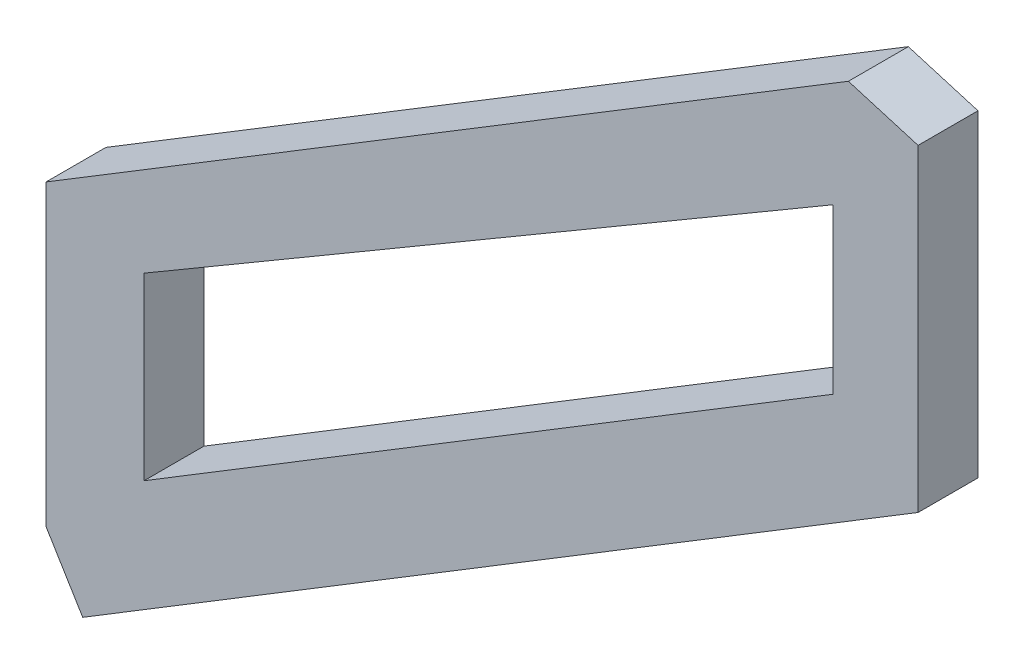
ISO-10303-21;
HEADER;
FILE_DESCRIPTION(('STEP AP214'),'2;1');
FILE_NAME('part.step','',(''),(''),'','','');
FILE_SCHEMA(('AUTOMOTIVE_DESIGN { 1 0 10303 214 1 1 1 1 }'));
ENDSEC;
DATA;
#1=APPLICATION_CONTEXT('core data for automotive mechanical design processes');
#2=APPLICATION_PROTOCOL_DEFINITION('international standard','automotive_design',2000,#1);
#3=PRODUCT_CONTEXT('',#1,'mechanical');
#4=PRODUCT('Part','Part','',(#3));
#5=PRODUCT_RELATED_PRODUCT_CATEGORY('part','',(#4));
#6=PRODUCT_DEFINITION_FORMATION('','',#4);
#7=PRODUCT_DEFINITION_CONTEXT('part definition',#1,'design');
#8=PRODUCT_DEFINITION('design','',#6,#7);
#9=PRODUCT_DEFINITION_SHAPE('','',#8);
#10=(LENGTH_UNIT() NAMED_UNIT(*) SI_UNIT(.MILLI.,.METRE.));
#11=(NAMED_UNIT(*) PLANE_ANGLE_UNIT() SI_UNIT($,.RADIAN.));
#12=(NAMED_UNIT(*) SI_UNIT($,.STERADIAN.) SOLID_ANGLE_UNIT());
#13=UNCERTAINTY_MEASURE_WITH_UNIT(LENGTH_MEASURE(1.E-05),#10,'distance_accuracy_value','');
#14=(GEOMETRIC_REPRESENTATION_CONTEXT(3) GLOBAL_UNCERTAINTY_ASSIGNED_CONTEXT((#13)) GLOBAL_UNIT_ASSIGNED_CONTEXT((#10,
#11,#12)) REPRESENTATION_CONTEXT('',''));
#15=CARTESIAN_POINT('',(0.,0.,0.));
#16=DIRECTION('',(0.,0.,1.));
#17=DIRECTION('',(1.,0.,0.));
#18=AXIS2_PLACEMENT_3D('',#15,#16,#17);
#19=CARTESIAN_POINT('',(0.115853437567894,14.2876628235082,0.));
#20=DIRECTION('',(0.,0.,-1.));
#21=DIRECTION('',(0.,-1.,0.));
#22=AXIS2_PLACEMENT_3D('',#19,#20,#21);
#23=PLANE('',#22);
#24=DIRECTION('',(0.854198477293924,0.519947075565141,0.));
#25=VECTOR('',#24,1.);
#26=CARTESIAN_POINT('',(0.701751053774181,14.5294103909423,0.));
#27=LINE('',#26,#25);
#28=CARTESIAN_POINT('',(-0.44824888714962,13.829410189493,0.));
#29=VERTEX_POINT('',#28);
#30=CARTESIAN_POINT('',(0.701751053774181,14.5294103909423,0.));
#31=VERTEX_POINT('',#30);
#32=EDGE_CURVE('E180',#29,#31,#27,.T.);
#33=ORIENTED_EDGE('',*,*,#32,.F.);
#34=DIRECTION('',(1.79754532891811E-07,-0.999999999999984,0.));
#35=VECTOR('',#34,1.);
#36=CARTESIAN_POINT('',(-0.44824888714962,13.829410189493,0.));
#37=LINE('',#36,#35);
#38=CARTESIAN_POINT('',(-0.448248941076026,14.1294104483369,0.));
#39=VERTEX_POINT('',#38);
#40=EDGE_CURVE('E194',#39,#29,#37,.T.);
#41=ORIENTED_EDGE('',*,*,#40,.F.);
#42=DIRECTION('',(-0.862791858811575,-0.505559302523914,0.));
#43=VECTOR('',#42,1.);
#44=CARTESIAN_POINT('',(-0.448248941076026,14.1294104483369,0.));
#45=LINE('',#44,#43);
#46=CARTESIAN_POINT('',(0.701751004548209,14.8032614640536,0.));
#47=VERTEX_POINT('',#46);
#48=EDGE_CURVE('E134',#47,#39,#45,.T.);
#49=ORIENTED_EDGE('',*,*,#48,.F.);
#50=DIRECTION('',(-1.79754534775004E-07,0.999999999999984,0.));
#51=VECTOR('',#50,1.);
#52=CARTESIAN_POINT('',(0.701751004548209,14.8032614640536,0.));
#53=LINE('',#52,#51);
#54=EDGE_CURVE('E120',#31,#47,#53,.T.);
#55=ORIENTED_EDGE('',*,*,#54,.F.);
#56=EDGE_LOOP('',(#33,#41,#49,#55));
#57=FACE_BOUND('',#56,.T.);
#58=DIRECTION('',(-0.854198477293923,-0.519947075565142,0.));
#59=VECTOR('',#58,1.);
#60=CARTESIAN_POINT('',(0.843550663553703,14.4294104352127,0.));
#61=LINE('',#60,#59);
#62=CARTESIAN_POINT('',(0.843550663553703,14.4294104352127,0.));
#63=VERTEX_POINT('',#62);
#64=CARTESIAN_POINT('',(-0.550574290724498,13.5808123491499,0.));
#65=VERTEX_POINT('',#64);
#66=EDGE_CURVE('E28',#63,#65,#61,.T.);
#67=ORIENTED_EDGE('',*,*,#66,.F.);
#68=DIRECTION('',(1.79754534730112E-07,-0.999999999999984,0.));
#69=VECTOR('',#68,1.);
#70=CARTESIAN_POINT('',(0.843550568174031,14.9600210977707,0.));
#71=LINE('',#70,#69);
#72=CARTESIAN_POINT('',(0.843550568174031,14.9600210977707,0.));
#73=VERTEX_POINT('',#72);
#74=EDGE_CURVE('E21',#73,#63,#71,.T.);
#75=ORIENTED_EDGE('',*,*,#74,.F.);
#76=DIRECTION('',(0.958722035180855,-0.284344965242362,0.));
#77=VECTOR('',#76,1.);
#78=CARTESIAN_POINT('',(0.727253688271433,14.9945132978665,0.));
#79=LINE('',#78,#77);
#80=CARTESIAN_POINT('',(0.727253688271433,14.9945132978665,0.));
#81=VERTEX_POINT('',#80);
#82=EDGE_CURVE('E147',#81,#73,#79,.T.);
#83=ORIENTED_EDGE('',*,*,#82,.F.);
#84=DIRECTION('',(0.854198477293924,0.51994707556514,0.));
#85=VECTOR('',#84,1.);
#86=CARTESIAN_POINT('',(-0.611843788417915,14.1794102095222,0.));
#87=LINE('',#86,#85);
#88=CARTESIAN_POINT('',(-0.611843788417915,14.1794102095222,0.));
#89=VERTEX_POINT('',#88);
#90=EDGE_CURVE('E209',#89,#81,#87,.T.);
#91=ORIENTED_EDGE('',*,*,#90,.F.);
#92=DIRECTION('',(-1.79754534642425E-07,0.999999999999984,0.));
#93=VECTOR('',#92,1.);
#94=CARTESIAN_POINT('',(-0.611843698910761,13.681469199889,0.));
#95=LINE('',#94,#93);
#96=CARTESIAN_POINT('',(-0.611843698910761,13.681469199889,0.));
#97=VERTEX_POINT('',#96);
#98=EDGE_CURVE('E167',#97,#89,#95,.T.);
#99=ORIENTED_EDGE('',*,*,#98,.F.);
#100=DIRECTION('',(-0.519947075565137,0.854198477293926,0.));
#101=VECTOR('',#100,1.);
#102=CARTESIAN_POINT('',(-0.550574290724498,13.5808123491499,0.));
#103=LINE('',#102,#101);
#104=EDGE_CURVE('E155',#65,#97,#103,.T.);
#105=ORIENTED_EDGE('',*,*,#104,.F.);
#106=EDGE_LOOP('',(#67,#75,#83,#91,#99,#105));
#107=FACE_BOUND('',#106,.T.);
#108=ADVANCED_FACE('F17',(#57,#107),#23,.F.);
#109=CARTESIAN_POINT('',(0.115853437567894,14.2876628235082,-0.1));
#110=DIRECTION('',(0.,0.,-1.));
#111=DIRECTION('',(0.,-1.,0.));
#112=AXIS2_PLACEMENT_3D('',#109,#110,#111);
#113=PLANE('',#112);
#114=DIRECTION('',(0.854198477293924,0.519947075565141,0.));
#115=VECTOR('',#114,1.);
#116=CARTESIAN_POINT('',(0.701751053774181,14.5294103909423,-0.1));
#117=LINE('',#116,#115);
#118=CARTESIAN_POINT('',(-0.44824888714962,13.829410189493,-0.1));
#119=VERTEX_POINT('',#118);
#120=CARTESIAN_POINT('',(0.701751053774181,14.5294103909423,-0.1));
#121=VERTEX_POINT('',#120);
#122=EDGE_CURVE('E114',#119,#121,#117,.T.);
#123=ORIENTED_EDGE('',*,*,#122,.T.);
#124=DIRECTION('',(-1.79754534775004E-07,0.999999999999984,0.));
#125=VECTOR('',#124,1.);
#126=CARTESIAN_POINT('',(0.701751004548209,14.8032614640536,-0.1));
#127=LINE('',#126,#125);
#128=CARTESIAN_POINT('',(0.701751004548209,14.8032614640536,-0.1));
#129=VERTEX_POINT('',#128);
#130=EDGE_CURVE('E107',#121,#129,#127,.T.);
#131=ORIENTED_EDGE('',*,*,#130,.T.);
#132=DIRECTION('',(-0.862791858811575,-0.505559302523914,0.));
#133=VECTOR('',#132,1.);
#134=CARTESIAN_POINT('',(-0.448248941076026,14.1294104483369,-0.1));
#135=LINE('',#134,#133);
#136=CARTESIAN_POINT('',(-0.448248941076026,14.1294104483369,-0.1));
#137=VERTEX_POINT('',#136);
#138=EDGE_CURVE('E112',#129,#137,#135,.T.);
#139=ORIENTED_EDGE('',*,*,#138,.T.);
#140=DIRECTION('',(1.79754532891811E-07,-0.999999999999984,0.));
#141=VECTOR('',#140,1.);
#142=CARTESIAN_POINT('',(-0.44824888714962,13.829410189493,-0.1));
#143=LINE('',#142,#141);
#144=EDGE_CURVE('E204',#137,#119,#143,.T.);
#145=ORIENTED_EDGE('',*,*,#144,.T.);
#146=EDGE_LOOP('',(#123,#131,#139,#145));
#147=FACE_BOUND('',#146,.T.);
#148=DIRECTION('',(-0.854198477293923,-0.519947075565142,0.));
#149=VECTOR('',#148,1.);
#150=CARTESIAN_POINT('',(0.843550663553703,14.4294104352127,-0.1));
#151=LINE('',#150,#149);
#152=CARTESIAN_POINT('',(0.843550663553704,14.4294104352127,-0.1));
#153=VERTEX_POINT('',#152);
#154=CARTESIAN_POINT('',(-0.550574290724498,13.5808123491499,-0.1));
#155=VERTEX_POINT('',#154);
#156=EDGE_CURVE('E11',#153,#155,#151,.T.);
#157=ORIENTED_EDGE('',*,*,#156,.T.);
#158=DIRECTION('',(-0.519947075565137,0.854198477293926,0.));
#159=VECTOR('',#158,1.);
#160=CARTESIAN_POINT('',(-0.550574290724498,13.5808123491499,-0.1));
#161=LINE('',#160,#159);
#162=CARTESIAN_POINT('',(-0.611843698910761,13.681469199889,-0.1));
#163=VERTEX_POINT('',#162);
#164=EDGE_CURVE('E165',#155,#163,#161,.T.);
#165=ORIENTED_EDGE('',*,*,#164,.T.);
#166=DIRECTION('',(-1.79754534642425E-07,0.999999999999984,0.));
#167=VECTOR('',#166,1.);
#168=CARTESIAN_POINT('',(-0.611843698910761,13.681469199889,-0.1));
#169=LINE('',#168,#167);
#170=CARTESIAN_POINT('',(-0.611843788417915,14.1794102095222,-0.1));
#171=VERTEX_POINT('',#170);
#172=EDGE_CURVE('E156',#163,#171,#169,.T.);
#173=ORIENTED_EDGE('',*,*,#172,.T.);
#174=DIRECTION('',(0.854198477293924,0.51994707556514,0.));
#175=VECTOR('',#174,1.);
#176=CARTESIAN_POINT('',(-0.611843788417915,14.1794102095222,-0.1));
#177=LINE('',#176,#175);
#178=CARTESIAN_POINT('',(0.727253688271433,14.9945132978665,-0.1));
#179=VERTEX_POINT('',#178);
#180=EDGE_CURVE('E193',#171,#179,#177,.T.);
#181=ORIENTED_EDGE('',*,*,#180,.T.);
#182=DIRECTION('',(0.958722035180855,-0.284344965242362,0.));
#183=VECTOR('',#182,1.);
#184=CARTESIAN_POINT('',(0.727253688271433,14.9945132978665,-0.1));
#185=LINE('',#184,#183);
#186=CARTESIAN_POINT('',(0.843550568174031,14.9600210977707,-0.1));
#187=VERTEX_POINT('',#186);
#188=EDGE_CURVE('E177',#179,#187,#185,.T.);
#189=ORIENTED_EDGE('',*,*,#188,.T.);
#190=DIRECTION('',(1.79754534730112E-07,-0.999999999999984,0.));
#191=VECTOR('',#190,1.);
#192=CARTESIAN_POINT('',(0.843550568174031,14.9600210977707,-0.1));
#193=LINE('',#192,#191);
#194=EDGE_CURVE('E148',#187,#153,#193,.T.);
#195=ORIENTED_EDGE('',*,*,#194,.T.);
#196=EDGE_LOOP('',(#157,#165,#173,#181,#189,#195));
#197=FACE_BOUND('',#196,.T.);
#198=ADVANCED_FACE('F109',(#147,#197),#113,.T.);
#199=CARTESIAN_POINT('',(0.843550663553703,14.4294104352127,0.));
#200=DIRECTION('',(0.519947075565142,-0.854198477293923,0.));
#201=DIRECTION('',(0.,0.,-1.));
#202=AXIS2_PLACEMENT_3D('',#199,#200,#201);
#203=PLANE('',#202);
#204=ORIENTED_EDGE('',*,*,#66,.T.);
#205=DIRECTION('',(0.,0.,-1.));
#206=VECTOR('',#205,1.);
#207=CARTESIAN_POINT('',(-0.550574290724498,13.5808123491499,0.));
#208=LINE('',#207,#206);
#209=EDGE_CURVE('E206',#65,#155,#208,.T.);
#210=ORIENTED_EDGE('',*,*,#209,.T.);
#211=ORIENTED_EDGE('',*,*,#156,.F.);
#212=DIRECTION('',(0.,0.,-1.));
#213=VECTOR('',#212,1.);
#214=CARTESIAN_POINT('',(0.843550663553703,14.4294104352127,0.));
#215=LINE('',#214,#213);
#216=EDGE_CURVE('E149',#63,#153,#215,.T.);
#217=ORIENTED_EDGE('',*,*,#216,.F.);
#218=EDGE_LOOP('',(#204,#210,#211,#217));
#219=FACE_BOUND('',#218,.T.);
#220=ADVANCED_FACE('F334',(#219),#203,.T.);
#221=CARTESIAN_POINT('',(-0.550574290724498,13.5808123491499,0.));
#222=DIRECTION('',(-0.854198477293926,-0.519947075565137,0.));
#223=DIRECTION('',(-0.519947075565137,0.854198477293926,0.));
#224=AXIS2_PLACEMENT_3D('',#221,#222,#223);
#225=PLANE('',#224);
#226=ORIENTED_EDGE('',*,*,#104,.T.);
#227=DIRECTION('',(0.,0.,-1.));
#228=VECTOR('',#227,1.);
#229=CARTESIAN_POINT('',(-0.611843698910761,13.681469199889,0.));
#230=LINE('',#229,#228);
#231=EDGE_CURVE('E152',#97,#163,#230,.T.);
#232=ORIENTED_EDGE('',*,*,#231,.T.);
#233=ORIENTED_EDGE('',*,*,#164,.F.);
#234=ORIENTED_EDGE('',*,*,#209,.F.);
#235=EDGE_LOOP('',(#226,#232,#233,#234));
#236=FACE_BOUND('',#235,.T.);
#237=ADVANCED_FACE('F337',(#236),#225,.T.);
#238=CARTESIAN_POINT('',(-0.611843698910761,13.681469199889,0.));
#239=DIRECTION('',(-0.999999999999984,-1.79754534642425E-07,0.));
#240=DIRECTION('',(-1.79754534642425E-07,0.999999999999984,0.));
#241=AXIS2_PLACEMENT_3D('',#238,#239,#240);
#242=PLANE('',#241);
#243=ORIENTED_EDGE('',*,*,#98,.T.);
#244=DIRECTION('',(0.,0.,-1.));
#245=VECTOR('',#244,1.);
#246=CARTESIAN_POINT('',(-0.611843788417915,14.1794102095222,0.));
#247=LINE('',#246,#245);
#248=EDGE_CURVE('E174',#89,#171,#247,.T.);
#249=ORIENTED_EDGE('',*,*,#248,.T.);
#250=ORIENTED_EDGE('',*,*,#172,.F.);
#251=ORIENTED_EDGE('',*,*,#231,.F.);
#252=EDGE_LOOP('',(#243,#249,#250,#251));
#253=FACE_BOUND('',#252,.T.);
#254=ADVANCED_FACE('F380',(#253),#242,.T.);
#255=CARTESIAN_POINT('',(-0.611843788417915,14.1794102095222,0.));
#256=DIRECTION('',(-0.51994707556514,0.854198477293924,0.));
#257=DIRECTION('',(0.,0.,1.));
#258=AXIS2_PLACEMENT_3D('',#255,#256,#257);
#259=PLANE('',#258);
#260=ORIENTED_EDGE('',*,*,#90,.T.);
#261=DIRECTION('',(0.,0.,-1.));
#262=VECTOR('',#261,1.);
#263=CARTESIAN_POINT('',(0.727253688271433,14.9945132978665,0.));
#264=LINE('',#263,#262);
#265=EDGE_CURVE('E212',#81,#179,#264,.T.);
#266=ORIENTED_EDGE('',*,*,#265,.T.);
#267=ORIENTED_EDGE('',*,*,#180,.F.);
#268=ORIENTED_EDGE('',*,*,#248,.F.);
#269=EDGE_LOOP('',(#260,#266,#267,#268));
#270=FACE_BOUND('',#269,.T.);
#271=ADVANCED_FACE('F322',(#270),#259,.T.);
#272=CARTESIAN_POINT('',(0.727253688271433,14.9945132978665,0.));
#273=DIRECTION('',(0.284344965242362,0.958722035180855,0.));
#274=DIRECTION('',(0.,0.,-1.));
#275=AXIS2_PLACEMENT_3D('',#272,#273,#274);
#276=PLANE('',#275);
#277=ORIENTED_EDGE('',*,*,#82,.T.);
#278=DIRECTION('',(0.,0.,-1.));
#279=VECTOR('',#278,1.);
#280=CARTESIAN_POINT('',(0.843550568174031,14.9600210977707,0.));
#281=LINE('',#280,#279);
#282=EDGE_CURVE('E143',#73,#187,#281,.T.);
#283=ORIENTED_EDGE('',*,*,#282,.T.);
#284=ORIENTED_EDGE('',*,*,#188,.F.);
#285=ORIENTED_EDGE('',*,*,#265,.F.);
#286=EDGE_LOOP('',(#277,#283,#284,#285));
#287=FACE_BOUND('',#286,.T.);
#288=ADVANCED_FACE('F326',(#287),#276,.T.);
#289=CARTESIAN_POINT('',(0.843550568174031,14.9600210977707,0.));
#290=DIRECTION('',(0.999999999999984,1.79754534730112E-07,0.));
#291=DIRECTION('',(0.,0.,-1.));
#292=AXIS2_PLACEMENT_3D('',#289,#290,#291);
#293=PLANE('',#292);
#294=ORIENTED_EDGE('',*,*,#74,.T.);
#295=ORIENTED_EDGE('',*,*,#216,.T.);
#296=ORIENTED_EDGE('',*,*,#194,.F.);
#297=ORIENTED_EDGE('',*,*,#282,.F.);
#298=EDGE_LOOP('',(#294,#295,#296,#297));
#299=FACE_BOUND('',#298,.T.);
#300=ADVANCED_FACE('F331',(#299),#293,.T.);
#301=CARTESIAN_POINT('',(-0.448248887149619,13.829410189493,0.));
#302=DIRECTION('',(-0.519947075565141,0.854198477293924,0.));
#303=DIRECTION('',(0.,0.,1.));
#304=AXIS2_PLACEMENT_3D('',#301,#302,#303);
#305=PLANE('',#304);
#306=ORIENTED_EDGE('',*,*,#32,.T.);
#307=DIRECTION('',(0.,0.,-1.));
#308=VECTOR('',#307,1.);
#309=CARTESIAN_POINT('',(0.701751053774181,14.5294103909423,0.));
#310=LINE('',#309,#308);
#311=EDGE_CURVE('E119',#31,#121,#310,.T.);
#312=ORIENTED_EDGE('',*,*,#311,.T.);
#313=ORIENTED_EDGE('',*,*,#122,.F.);
#314=DIRECTION('',(0.,0.,-1.));
#315=VECTOR('',#314,1.);
#316=CARTESIAN_POINT('',(-0.44824888714962,13.829410189493,0.));
#317=LINE('',#316,#315);
#318=EDGE_CURVE('E198',#29,#119,#317,.T.);
#319=ORIENTED_EDGE('',*,*,#318,.F.);
#320=EDGE_LOOP('',(#306,#312,#313,#319));
#321=FACE_BOUND('',#320,.T.);
#322=ADVANCED_FACE('F349',(#321),#305,.T.);
#323=CARTESIAN_POINT('',(0.701751053774182,14.5294103909423,0.));
#324=DIRECTION('',(-0.999999999999984,-1.79754534775004E-07,0.));
#325=DIRECTION('',(-1.79754534775004E-07,0.999999999999984,0.));
#326=AXIS2_PLACEMENT_3D('',#323,#324,#325);
#327=PLANE('',#326);
#328=ORIENTED_EDGE('',*,*,#54,.T.);
#329=DIRECTION('',(0.,0.,-1.));
#330=VECTOR('',#329,1.);
#331=CARTESIAN_POINT('',(0.701751004548209,14.8032614640536,0.));
#332=LINE('',#331,#330);
#333=EDGE_CURVE('E123',#47,#129,#332,.T.);
#334=ORIENTED_EDGE('',*,*,#333,.T.);
#335=ORIENTED_EDGE('',*,*,#130,.F.);
#336=ORIENTED_EDGE('',*,*,#311,.F.);
#337=EDGE_LOOP('',(#328,#334,#335,#336));
#338=FACE_BOUND('',#337,.T.);
#339=ADVANCED_FACE('F19',(#338),#327,.T.);
#340=CARTESIAN_POINT('',(0.701751004548209,14.8032614640536,0.));
#341=DIRECTION('',(0.505559302523914,-0.862791858811575,0.));
#342=DIRECTION('',(0.,0.,-1.));
#343=AXIS2_PLACEMENT_3D('',#340,#341,#342);
#344=PLANE('',#343);
#345=ORIENTED_EDGE('',*,*,#48,.T.);
#346=DIRECTION('',(0.,0.,-1.));
#347=VECTOR('',#346,1.);
#348=CARTESIAN_POINT('',(-0.448248941076026,14.1294104483369,0.));
#349=LINE('',#348,#347);
#350=EDGE_CURVE('E131',#39,#137,#349,.T.);
#351=ORIENTED_EDGE('',*,*,#350,.T.);
#352=ORIENTED_EDGE('',*,*,#138,.F.);
#353=ORIENTED_EDGE('',*,*,#333,.F.);
#354=EDGE_LOOP('',(#345,#351,#352,#353));
#355=FACE_BOUND('',#354,.T.);
#356=ADVANCED_FACE('F129',(#355),#344,.T.);
#357=CARTESIAN_POINT('',(-0.448248941076026,14.1294104483369,0.));
#358=DIRECTION('',(0.999999999999984,1.79754532891811E-07,0.));
#359=DIRECTION('',(0.,0.,-1.));
#360=AXIS2_PLACEMENT_3D('',#357,#358,#359);
#361=PLANE('',#360);
#362=ORIENTED_EDGE('',*,*,#40,.T.);
#363=ORIENTED_EDGE('',*,*,#318,.T.);
#364=ORIENTED_EDGE('',*,*,#144,.F.);
#365=ORIENTED_EDGE('',*,*,#350,.F.);
#366=EDGE_LOOP('',(#362,#363,#364,#365));
#367=FACE_BOUND('',#366,.T.);
#368=ADVANCED_FACE('F357',(#367),#361,.T.);
#369=CLOSED_SHELL('',(#108,#198,#220,#237,#254,#271,#288,#300,#322,#339,#356,#368));
#370=MANIFOLD_SOLID_BREP('B1',#369);
#371=ADVANCED_BREP_SHAPE_REPRESENTATION('',(#18,#370),#14);
#372=SHAPE_DEFINITION_REPRESENTATION(#9,#371);
ENDSEC;
END-ISO-10303-21;
